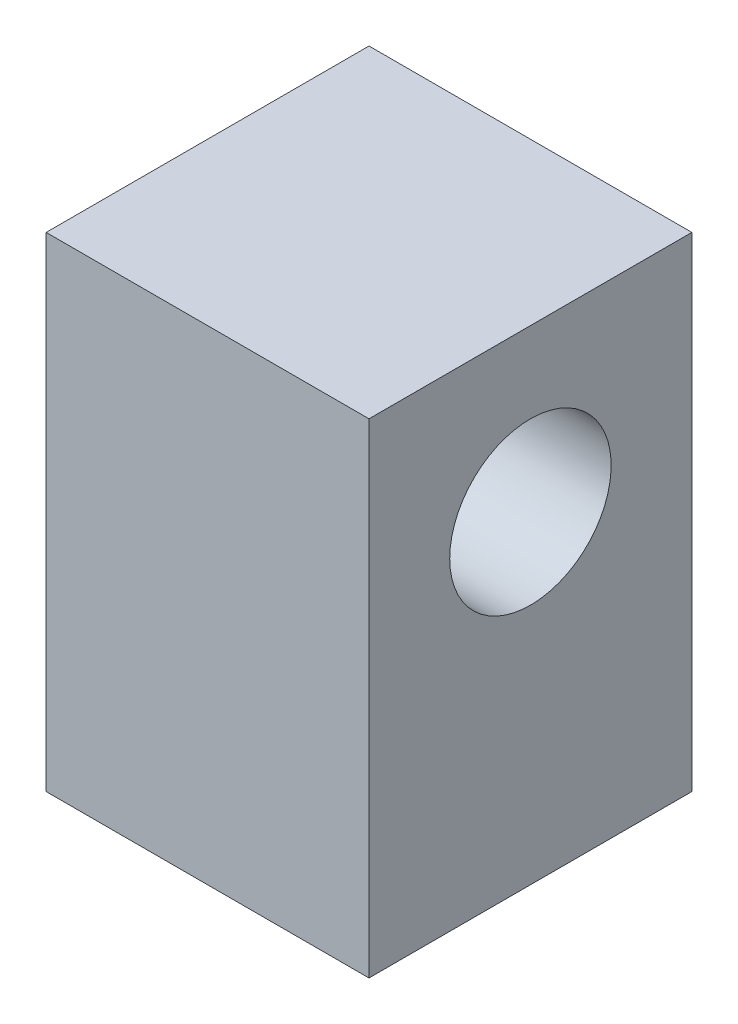
ISO-10303-21;
HEADER;
FILE_DESCRIPTION(('STEP AP214'),'2;1');
FILE_NAME('part.step','',(''),(''),'','','');
FILE_SCHEMA(('AUTOMOTIVE_DESIGN { 1 0 10303 214 1 1 1 1 }'));
ENDSEC;
DATA;
#1=APPLICATION_CONTEXT('core data for automotive mechanical design processes');
#2=APPLICATION_PROTOCOL_DEFINITION('international standard','automotive_design',2000,#1);
#3=PRODUCT_CONTEXT('',#1,'mechanical');
#4=PRODUCT('Part','Part','',(#3));
#5=PRODUCT_RELATED_PRODUCT_CATEGORY('part','',(#4));
#6=PRODUCT_DEFINITION_FORMATION('','',#4);
#7=PRODUCT_DEFINITION_CONTEXT('part definition',#1,'design');
#8=PRODUCT_DEFINITION('design','',#6,#7);
#9=PRODUCT_DEFINITION_SHAPE('','',#8);
#10=(LENGTH_UNIT() NAMED_UNIT(*) SI_UNIT(.MILLI.,.METRE.));
#11=(NAMED_UNIT(*) PLANE_ANGLE_UNIT() SI_UNIT($,.RADIAN.));
#12=(NAMED_UNIT(*) SI_UNIT($,.STERADIAN.) SOLID_ANGLE_UNIT());
#13=UNCERTAINTY_MEASURE_WITH_UNIT(LENGTH_MEASURE(1.E-05),#10,'distance_accuracy_value','');
#14=(GEOMETRIC_REPRESENTATION_CONTEXT(3) GLOBAL_UNCERTAINTY_ASSIGNED_CONTEXT((#13)) GLOBAL_UNIT_ASSIGNED_CONTEXT((#10,
#11,#12)) REPRESENTATION_CONTEXT('',''));
#15=CARTESIAN_POINT('',(0.,0.,0.));
#16=DIRECTION('',(0.,0.,1.));
#17=DIRECTION('',(1.,0.,0.));
#18=AXIS2_PLACEMENT_3D('',#15,#16,#17);
#19=CARTESIAN_POINT('',(20.,60.,20.));
#20=DIRECTION('',(-1.,0.,0.));
#21=DIRECTION('',(0.,0.,1.));
#22=AXIS2_PLACEMENT_3D('',#19,#20,#21);
#23=PLANE('',#22);
#24=CARTESIAN_POINT('',(20.,40.,0.));
#25=DIRECTION('',(-1.,0.,0.));
#26=DIRECTION('',(0.,0.,1.));
#27=AXIS2_PLACEMENT_3D('',#24,#25,#26);
#28=CIRCLE('',#27,10.);
#29=CARTESIAN_POINT('',(20.,40.,10.));
#30=VERTEX_POINT('',#29);
#31=EDGE_CURVE('E111',#30,#30,#28,.T.);
#32=ORIENTED_EDGE('',*,*,#31,.T.);
#33=EDGE_LOOP('',(#32));
#34=FACE_BOUND('',#33,.T.);
#35=DIRECTION('',(0.,0.,-1.));
#36=VECTOR('',#35,1.);
#37=CARTESIAN_POINT('',(20.,0.,20.));
#38=LINE('',#37,#36);
#39=CARTESIAN_POINT('',(20.,0.,20.));
#40=VERTEX_POINT('',#39);
#41=CARTESIAN_POINT('',(20.,0.,-20.));
#42=VERTEX_POINT('',#41);
#43=EDGE_CURVE('E107',#40,#42,#38,.T.);
#44=ORIENTED_EDGE('',*,*,#43,.T.);
#45=DIRECTION('',(0.,-1.,0.));
#46=VECTOR('',#45,1.);
#47=CARTESIAN_POINT('',(20.,60.,-20.));
#48=LINE('',#47,#46);
#49=CARTESIAN_POINT('',(20.,60.,-20.));
#50=VERTEX_POINT('',#49);
#51=EDGE_CURVE('E11',#50,#42,#48,.T.);
#52=ORIENTED_EDGE('',*,*,#51,.F.);
#53=DIRECTION('',(0.,0.,-1.));
#54=VECTOR('',#53,1.);
#55=CARTESIAN_POINT('',(20.,60.,20.));
#56=LINE('',#55,#54);
#57=CARTESIAN_POINT('',(20.,60.,20.));
#58=VERTEX_POINT('',#57);
#59=EDGE_CURVE('E91',#58,#50,#56,.T.);
#60=ORIENTED_EDGE('',*,*,#59,.F.);
#61=DIRECTION('',(0.,-1.,0.));
#62=VECTOR('',#61,1.);
#63=CARTESIAN_POINT('',(20.,60.,20.));
#64=LINE('',#63,#62);
#65=EDGE_CURVE('E103',#58,#40,#64,.T.);
#66=ORIENTED_EDGE('',*,*,#65,.T.);
#67=EDGE_LOOP('',(#44,#52,#60,#66));
#68=FACE_BOUND('',#67,.T.);
#69=ADVANCED_FACE('F39',(#34,#68),#23,.F.);
#70=CARTESIAN_POINT('',(-20.,60.,-20.));
#71=DIRECTION('',(0.,0.,1.));
#72=DIRECTION('',(1.,0.,0.));
#73=AXIS2_PLACEMENT_3D('',#70,#71,#72);
#74=PLANE('',#73);
#75=DIRECTION('',(-1.,0.,0.));
#76=VECTOR('',#75,1.);
#77=CARTESIAN_POINT('',(-20.,0.,-20.));
#78=LINE('',#77,#76);
#79=CARTESIAN_POINT('',(-20.,0.,-20.));
#80=VERTEX_POINT('',#79);
#81=EDGE_CURVE('E96',#42,#80,#78,.T.);
#82=ORIENTED_EDGE('',*,*,#81,.T.);
#83=DIRECTION('',(0.,-1.,0.));
#84=VECTOR('',#83,1.);
#85=CARTESIAN_POINT('',(-20.,60.,-20.));
#86=LINE('',#85,#84);
#87=CARTESIAN_POINT('',(-20.,60.,-20.));
#88=VERTEX_POINT('',#87);
#89=EDGE_CURVE('E48',#88,#80,#86,.T.);
#90=ORIENTED_EDGE('',*,*,#89,.F.);
#91=DIRECTION('',(-1.,0.,0.));
#92=VECTOR('',#91,1.);
#93=CARTESIAN_POINT('',(-20.,60.,-20.));
#94=LINE('',#93,#92);
#95=EDGE_CURVE('E86',#50,#88,#94,.T.);
#96=ORIENTED_EDGE('',*,*,#95,.F.);
#97=ORIENTED_EDGE('',*,*,#51,.T.);
#98=EDGE_LOOP('',(#82,#90,#96,#97));
#99=FACE_BOUND('',#98,.T.);
#100=ADVANCED_FACE('F95',(#99),#74,.F.);
#101=CARTESIAN_POINT('',(-20.,60.,20.));
#102=DIRECTION('',(1.,0.,0.));
#103=DIRECTION('',(0.,0.,-1.));
#104=AXIS2_PLACEMENT_3D('',#101,#102,#103);
#105=PLANE('',#104);
#106=CARTESIAN_POINT('',(-20.,40.,0.));
#107=DIRECTION('',(-1.,0.,0.));
#108=DIRECTION('',(0.,0.,1.));
#109=AXIS2_PLACEMENT_3D('',#106,#107,#108);
#110=CIRCLE('',#109,10.);
#111=CARTESIAN_POINT('',(-20.,40.,10.));
#112=VERTEX_POINT('',#111);
#113=EDGE_CURVE('E128',#112,#112,#110,.T.);
#114=ORIENTED_EDGE('',*,*,#113,.F.);
#115=EDGE_LOOP('',(#114));
#116=FACE_BOUND('',#115,.T.);
#117=DIRECTION('',(0.,0.,1.));
#118=VECTOR('',#117,1.);
#119=CARTESIAN_POINT('',(-20.,0.,20.));
#120=LINE('',#119,#118);
#121=CARTESIAN_POINT('',(-20.,0.,20.));
#122=VERTEX_POINT('',#121);
#123=EDGE_CURVE('E73',#80,#122,#120,.T.);
#124=ORIENTED_EDGE('',*,*,#123,.T.);
#125=DIRECTION('',(0.,-1.,0.));
#126=VECTOR('',#125,1.);
#127=CARTESIAN_POINT('',(-20.,60.,20.));
#128=LINE('',#127,#126);
#129=CARTESIAN_POINT('',(-20.,60.,20.));
#130=VERTEX_POINT('',#129);
#131=EDGE_CURVE('E98',#130,#122,#128,.T.);
#132=ORIENTED_EDGE('',*,*,#131,.F.);
#133=DIRECTION('',(0.,0.,1.));
#134=VECTOR('',#133,1.);
#135=CARTESIAN_POINT('',(-20.,60.,20.));
#136=LINE('',#135,#134);
#137=EDGE_CURVE('E89',#88,#130,#136,.T.);
#138=ORIENTED_EDGE('',*,*,#137,.F.);
#139=ORIENTED_EDGE('',*,*,#89,.T.);
#140=EDGE_LOOP('',(#124,#132,#138,#139));
#141=FACE_BOUND('',#140,.T.);
#142=ADVANCED_FACE('F99',(#116,#141),#105,.F.);
#143=CARTESIAN_POINT('',(-20.,60.,20.));
#144=DIRECTION('',(0.,0.,-1.));
#145=DIRECTION('',(-1.,0.,0.));
#146=AXIS2_PLACEMENT_3D('',#143,#144,#145);
#147=PLANE('',#146);
#148=DIRECTION('',(1.,0.,0.));
#149=VECTOR('',#148,1.);
#150=CARTESIAN_POINT('',(-20.,0.,20.));
#151=LINE('',#150,#149);
#152=EDGE_CURVE('E79',#122,#40,#151,.T.);
#153=ORIENTED_EDGE('',*,*,#152,.T.);
#154=ORIENTED_EDGE('',*,*,#65,.F.);
#155=DIRECTION('',(1.,0.,0.));
#156=VECTOR('',#155,1.);
#157=CARTESIAN_POINT('',(-20.,60.,20.));
#158=LINE('',#157,#156);
#159=EDGE_CURVE('E56',#130,#58,#158,.T.);
#160=ORIENTED_EDGE('',*,*,#159,.F.);
#161=ORIENTED_EDGE('',*,*,#131,.T.);
#162=EDGE_LOOP('',(#153,#154,#160,#161));
#163=FACE_BOUND('',#162,.T.);
#164=ADVANCED_FACE('F121',(#163),#147,.F.);
#165=CARTESIAN_POINT('',(0.,60.,0.));
#166=DIRECTION('',(0.,-1.,0.));
#167=DIRECTION('',(0.,0.,-1.));
#168=AXIS2_PLACEMENT_3D('',#165,#166,#167);
#169=PLANE('',#168);
#170=ORIENTED_EDGE('',*,*,#59,.T.);
#171=ORIENTED_EDGE('',*,*,#95,.T.);
#172=ORIENTED_EDGE('',*,*,#137,.T.);
#173=ORIENTED_EDGE('',*,*,#159,.T.);
#174=EDGE_LOOP('',(#170,#171,#172,#173));
#175=FACE_BOUND('',#174,.T.);
#176=ADVANCED_FACE('F87',(#175),#169,.F.);
#177=CARTESIAN_POINT('',(0.,0.,0.));
#178=DIRECTION('',(0.,-1.,0.));
#179=DIRECTION('',(0.,0.,-1.));
#180=AXIS2_PLACEMENT_3D('',#177,#178,#179);
#181=PLANE('',#180);
#182=ORIENTED_EDGE('',*,*,#43,.F.);
#183=ORIENTED_EDGE('',*,*,#152,.F.);
#184=ORIENTED_EDGE('',*,*,#123,.F.);
#185=ORIENTED_EDGE('',*,*,#81,.F.);
#186=EDGE_LOOP('',(#182,#183,#184,#185));
#187=FACE_BOUND('',#186,.T.);
#188=ADVANCED_FACE('F124',(#187),#181,.T.);
#189=CARTESIAN_POINT('',(20.,40.,0.));
#190=DIRECTION('',(-1.,0.,0.));
#191=DIRECTION('',(0.,0.,1.));
#192=AXIS2_PLACEMENT_3D('',#189,#190,#191);
#193=CYLINDRICAL_SURFACE('',#192,10.);
#194=ORIENTED_EDGE('',*,*,#31,.F.);
#195=EDGE_LOOP('',(#194));
#196=FACE_BOUND('',#195,.T.);
#197=ORIENTED_EDGE('',*,*,#113,.T.);
#198=EDGE_LOOP('',(#197));
#199=FACE_BOUND('',#198,.T.);
#200=ADVANCED_FACE('F137',(#196,#199),#193,.F.);
#201=CLOSED_SHELL('',(#69,#100,#142,#164,#176,#188,#200));
#202=MANIFOLD_SOLID_BREP('B2',#201);
#203=ADVANCED_BREP_SHAPE_REPRESENTATION('',(#18,#202),#14);
#204=SHAPE_DEFINITION_REPRESENTATION(#9,#203);
ENDSEC;
END-ISO-10303-21;
